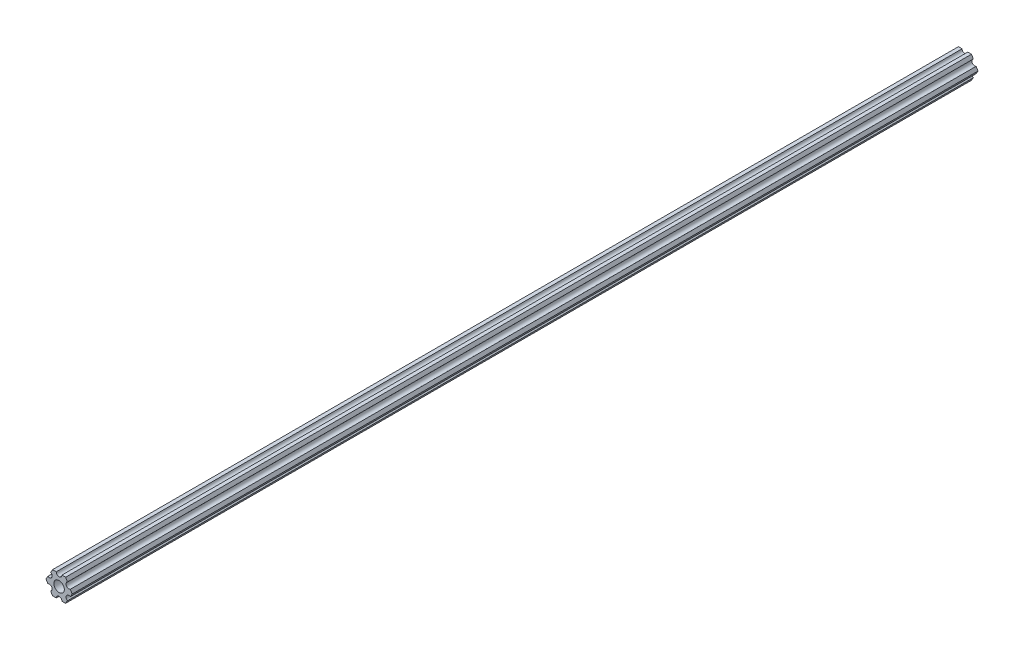
ISO-10303-21;
HEADER;
FILE_DESCRIPTION(('STEP AP214'),'2;1');
FILE_NAME('part.step','',(''),(''),'','','');
FILE_SCHEMA(('AUTOMOTIVE_DESIGN { 1 0 10303 214 1 1 1 1 }'));
ENDSEC;
DATA;
#1=APPLICATION_CONTEXT('core data for automotive mechanical design processes');
#2=APPLICATION_PROTOCOL_DEFINITION('international standard','automotive_design',2000,#1);
#3=PRODUCT_CONTEXT('',#1,'mechanical');
#4=PRODUCT('Part','Part','',(#3));
#5=PRODUCT_RELATED_PRODUCT_CATEGORY('part','',(#4));
#6=PRODUCT_DEFINITION_FORMATION('','',#4);
#7=PRODUCT_DEFINITION_CONTEXT('part definition',#1,'design');
#8=PRODUCT_DEFINITION('design','',#6,#7);
#9=PRODUCT_DEFINITION_SHAPE('','',#8);
#10=(LENGTH_UNIT() NAMED_UNIT(*) SI_UNIT(.MILLI.,.METRE.));
#11=(NAMED_UNIT(*) PLANE_ANGLE_UNIT() SI_UNIT($,.RADIAN.));
#12=(NAMED_UNIT(*) SI_UNIT($,.STERADIAN.) SOLID_ANGLE_UNIT());
#13=UNCERTAINTY_MEASURE_WITH_UNIT(LENGTH_MEASURE(1.E-05),#10,'distance_accuracy_value','');
#14=(GEOMETRIC_REPRESENTATION_CONTEXT(3) GLOBAL_UNCERTAINTY_ASSIGNED_CONTEXT((#13)) GLOBAL_UNIT_ASSIGNED_CONTEXT((#10,
#11,#12)) REPRESENTATION_CONTEXT('',''));
#15=CARTESIAN_POINT('',(0.,0.,0.));
#16=DIRECTION('',(0.,0.,1.));
#17=DIRECTION('',(1.,0.,0.));
#18=AXIS2_PLACEMENT_3D('',#15,#16,#17);
#19=CARTESIAN_POINT('',(6.29301142309098,-1.80018429024546,85.725));
#20=DIRECTION('',(-0.866025434075723,0.499999947533953,0.));
#21=DIRECTION('',(0.,0.,1.));
#22=AXIS2_PLACEMENT_3D('',#19,#20,#21);
#23=PLANE('',#22);
#24=DIRECTION('',(0.,0.,1.));
#25=VECTOR('',#24,1.);
#26=CARTESIAN_POINT('',(7.33234841870827,4.44212519169686E-07,85.725));
#27=LINE('',#26,#25);
#28=CARTESIAN_POINT('',(7.33234841870826,4.44212518961143E-07,-422.275));
#29=VERTEX_POINT('',#28);
#30=CARTESIAN_POINT('',(7.33234841870826,4.44212519315656E-07,85.725));
#31=VERTEX_POINT('',#30);
#32=EDGE_CURVE('E12',#29,#31,#27,.T.);
#33=ORIENTED_EDGE('',*,*,#32,.T.);
#34=DIRECTION('',(0.499999947533953,0.866025434075723,0.));
#35=VECTOR('',#34,1.);
#36=CARTESIAN_POINT('',(6.29301142309098,-1.80018429024546,85.725));
#37=LINE('',#36,#35);
#38=CARTESIAN_POINT('',(6.29301142309098,-1.80018429024546,85.725));
#39=VERTEX_POINT('',#38);
#40=EDGE_CURVE('E303',#39,#31,#37,.T.);
#41=ORIENTED_EDGE('',*,*,#40,.F.);
#42=DIRECTION('',(0.,0.,-1.));
#43=VECTOR('',#42,1.);
#44=CARTESIAN_POINT('',(6.29301142309098,-1.80018429024546,85.725));
#45=LINE('',#44,#43);
#46=CARTESIAN_POINT('',(6.29301142309098,-1.80018429024546,-422.275));
#47=VERTEX_POINT('',#46);
#48=EDGE_CURVE('E302',#39,#47,#45,.T.);
#49=ORIENTED_EDGE('',*,*,#48,.T.);
#50=DIRECTION('',(-0.499999947533953,-0.866025434075723,0.));
#51=VECTOR('',#50,1.);
#52=CARTESIAN_POINT('',(6.29301142309098,-1.80018429024546,-422.275));
#53=LINE('',#52,#51);
#54=EDGE_CURVE('E221',#29,#47,#53,.T.);
#55=ORIENTED_EDGE('',*,*,#54,.F.);
#56=EDGE_LOOP('',(#33,#41,#49,#55));
#57=FACE_BOUND('',#56,.T.);
#58=ADVANCED_FACE('F53',(#57),#23,.F.);
#59=CARTESIAN_POINT('',(7.33234841870827,4.44212519169686E-07,85.725));
#60=DIRECTION('',(-0.866025373493145,-0.500000052466057,0.));
#61=DIRECTION('',(-0.500000052466057,0.866025373493145,0.));
#62=AXIS2_PLACEMENT_3D('',#59,#60,#61);
#63=PLANE('',#62);
#64=DIRECTION('',(0.,0.,1.));
#65=VECTOR('',#64,1.);
#66=CARTESIAN_POINT('',(6.29301120497139,1.80018505273894,85.725));
#67=LINE('',#66,#65);
#68=CARTESIAN_POINT('',(6.29301120497139,1.80018505273894,-422.275));
#69=VERTEX_POINT('',#68);
#70=CARTESIAN_POINT('',(6.29301120497139,1.80018505273894,85.725));
#71=VERTEX_POINT('',#70);
#72=EDGE_CURVE('E61',#69,#71,#67,.T.);
#73=ORIENTED_EDGE('',*,*,#72,.T.);
#74=DIRECTION('',(-0.500000052466057,0.866025373493145,0.));
#75=VECTOR('',#74,1.);
#76=CARTESIAN_POINT('',(7.33234841870827,4.44212519198906E-07,85.725));
#77=LINE('',#76,#75);
#78=EDGE_CURVE('E307',#31,#71,#77,.T.);
#79=ORIENTED_EDGE('',*,*,#78,.F.);
#80=ORIENTED_EDGE('',*,*,#32,.F.);
#81=DIRECTION('',(0.500000052466055,-0.866025373493145,0.));
#82=VECTOR('',#81,1.);
#83=CARTESIAN_POINT('',(7.33234841870826,4.44212518961143E-07,-422.275));
#84=LINE('',#83,#82);
#85=EDGE_CURVE('E215',#69,#29,#84,.T.);
#86=ORIENTED_EDGE('',*,*,#85,.F.);
#87=EDGE_LOOP('',(#73,#79,#80,#86));
#88=FACE_BOUND('',#87,.T.);
#89=ADVANCED_FACE('F216',(#88),#63,.F.);
#90=CARTESIAN_POINT('',(4.70551103839172,4.54981561357972,85.725));
#91=DIRECTION('',(-0.866025373493151,-0.500000052466046,0.));
#92=DIRECTION('',(-0.500000052466046,0.866025373493151,0.));
#93=AXIS2_PLACEMENT_3D('',#90,#91,#92);
#94=PLANE('',#93);
#95=DIRECTION('',(0.,0.,1.));
#96=VECTOR('',#95,1.);
#97=CARTESIAN_POINT('',(3.66617382465481,6.35000022210627,85.725));
#98=LINE('',#97,#96);
#99=CARTESIAN_POINT('',(3.66617382465481,6.35000022210627,-422.275));
#100=VERTEX_POINT('',#99);
#101=CARTESIAN_POINT('',(3.66617382465481,6.35000022210627,85.725));
#102=VERTEX_POINT('',#101);
#103=EDGE_CURVE('E213',#100,#102,#98,.T.);
#104=ORIENTED_EDGE('',*,*,#103,.T.);
#105=DIRECTION('',(-0.500000052466046,0.866025373493151,0.));
#106=VECTOR('',#105,1.);
#107=CARTESIAN_POINT('',(4.70551103839172,4.54981561357972,85.725));
#108=LINE('',#107,#106);
#109=CARTESIAN_POINT('',(4.70551103839172,4.54981561357972,85.725));
#110=VERTEX_POINT('',#109);
#111=EDGE_CURVE('E338',#110,#102,#108,.T.);
#112=ORIENTED_EDGE('',*,*,#111,.F.);
#113=DIRECTION('',(0.,0.,1.));
#114=VECTOR('',#113,1.);
#115=CARTESIAN_POINT('',(4.70551103839172,4.54981561357972,85.725));
#116=LINE('',#115,#114);
#117=CARTESIAN_POINT('',(4.70551103839172,4.54981561357972,-422.275));
#118=VERTEX_POINT('',#117);
#119=EDGE_CURVE('E301',#118,#110,#116,.T.);
#120=ORIENTED_EDGE('',*,*,#119,.F.);
#121=DIRECTION('',(0.500000052466045,-0.866025373493151,0.));
#122=VECTOR('',#121,1.);
#123=CARTESIAN_POINT('',(4.70551103839172,4.54981561357972,-422.275));
#124=LINE('',#123,#122);
#125=EDGE_CURVE('E227',#100,#118,#124,.T.);
#126=ORIENTED_EDGE('',*,*,#125,.F.);
#127=EDGE_LOOP('',(#104,#112,#120,#126));
#128=FACE_BOUND('',#127,.T.);
#129=ADVANCED_FACE('F414',(#128),#94,.F.);
#130=CARTESIAN_POINT('',(3.66617382465481,6.35000022210627,85.725));
#131=DIRECTION('',(6.05825850611185E-08,-1.,0.));
#132=DIRECTION('',(0.,0.,-1.));
#133=AXIS2_PLACEMENT_3D('',#130,#131,#132);
#134=PLANE('',#133);
#135=DIRECTION('',(0.,0.,1.));
#136=VECTOR('',#135,1.);
#137=CARTESIAN_POINT('',(1.58749961530074,6.35000009617482,85.725));
#138=LINE('',#137,#136);
#139=CARTESIAN_POINT('',(1.58749961530073,6.35000015914054,-422.275));
#140=VERTEX_POINT('',#139);
#141=CARTESIAN_POINT('',(1.58749961530073,6.35000015914054,85.725));
#142=VERTEX_POINT('',#141);
#143=EDGE_CURVE('E335',#140,#142,#138,.T.);
#144=ORIENTED_EDGE('',*,*,#143,.T.);
#145=DIRECTION('',(-1.,0.,0.));
#146=VECTOR('',#145,1.);
#147=CARTESIAN_POINT('',(5.49926112168156,6.35000022210627,85.725));
#148=LINE('',#147,#146);
#149=EDGE_CURVE('E342',#102,#142,#148,.T.);
#150=ORIENTED_EDGE('',*,*,#149,.F.);
#151=ORIENTED_EDGE('',*,*,#103,.F.);
#152=DIRECTION('',(1.,3.02912931564594E-08,0.));
#153=VECTOR('',#152,1.);
#154=CARTESIAN_POINT('',(3.66617382465481,6.35000022210627,-422.275));
#155=LINE('',#154,#153);
#156=EDGE_CURVE('E289',#140,#100,#155,.T.);
#157=ORIENTED_EDGE('',*,*,#156,.F.);
#158=EDGE_LOOP('',(#144,#150,#151,#157));
#159=FACE_BOUND('',#158,.T.);
#160=ADVANCED_FACE('F417',(#159),#134,.F.);
#161=CARTESIAN_POINT('',(-3.84699260060323E-07,6.35,85.725));
#162=DIRECTION('',(0.,0.,-1.));
#163=DIRECTION('',(-1.,0.,0.));
#164=AXIS2_PLACEMENT_3D('',#161,#162,#163);
#165=CYLINDRICAL_SURFACE('',#164,1.5875);
#166=DIRECTION('',(0.,0.,1.));
#167=VECTOR('',#166,1.);
#168=CARTESIAN_POINT('',(-1.58750038469926,6.34999990382518,85.725));
#169=LINE('',#168,#167);
#170=CARTESIAN_POINT('',(-1.58750038469926,6.34999990382519,-422.275));
#171=VERTEX_POINT('',#170);
#172=CARTESIAN_POINT('',(-1.58750038469926,6.34999990382519,85.725));
#173=VERTEX_POINT('',#172);
#174=EDGE_CURVE('E332',#171,#173,#169,.T.);
#175=ORIENTED_EDGE('',*,*,#174,.T.);
#176=CARTESIAN_POINT('',(-3.84699260060323E-07,6.35,85.725));
#177=DIRECTION('',(0.,0.,-1.));
#178=DIRECTION('',(-1.,0.,0.));
#179=AXIS2_PLACEMENT_3D('',#176,#177,#178);
#180=CIRCLE('',#179,1.5875);
#181=EDGE_CURVE('E346',#142,#173,#180,.T.);
#182=ORIENTED_EDGE('',*,*,#181,.F.);
#183=ORIENTED_EDGE('',*,*,#143,.F.);
#184=CARTESIAN_POINT('',(-3.84699260060323E-07,6.35,-422.275));
#185=DIRECTION('',(0.,0.,1.));
#186=DIRECTION('',(-1.,0.,0.));
#187=AXIS2_PLACEMENT_3D('',#184,#185,#186);
#188=CIRCLE('',#187,1.5875);
#189=EDGE_CURVE('E285',#171,#140,#188,.T.);
#190=ORIENTED_EDGE('',*,*,#189,.F.);
#191=EDGE_LOOP('',(#175,#182,#183,#190));
#192=FACE_BOUND('',#191,.T.);
#193=ADVANCED_FACE('F466',(#192),#165,.F.);
#194=CARTESIAN_POINT('',(-1.58750038469926,6.34999990382518,85.725));
#195=DIRECTION('',(6.05825963273174E-08,-1.,0.));
#196=DIRECTION('',(0.,0.,-1.));
#197=AXIS2_PLACEMENT_3D('',#194,#195,#196);
#198=PLANE('',#197);
#199=DIRECTION('',(0.,0.,1.));
#200=VECTOR('',#199,1.);
#201=CARTESIAN_POINT('',(-3.66617459405349,6.3499997778937,85.725));
#202=LINE('',#201,#200);
#203=CARTESIAN_POINT('',(-3.66617454558244,6.34999986184803,-422.275));
#204=VERTEX_POINT('',#203);
#205=CARTESIAN_POINT('',(-3.66617454558244,6.34999986184803,85.725));
#206=VERTEX_POINT('',#205);
#207=EDGE_CURVE('E325',#204,#206,#202,.T.);
#208=ORIENTED_EDGE('',*,*,#207,.T.);
#209=DIRECTION('',(-1.,0.,0.));
#210=VECTOR('',#209,1.);
#211=CARTESIAN_POINT('',(5.49926112168156,6.34999990382519,85.725));
#212=LINE('',#211,#210);
#213=EDGE_CURVE('E350',#173,#206,#212,.T.);
#214=ORIENTED_EDGE('',*,*,#213,.F.);
#215=ORIENTED_EDGE('',*,*,#174,.F.);
#216=DIRECTION('',(1.,2.0194198968488E-08,0.));
#217=VECTOR('',#216,1.);
#218=CARTESIAN_POINT('',(-1.58750038469926,6.34999990382519,-422.275));
#219=LINE('',#218,#217);
#220=EDGE_CURVE('E281',#204,#171,#219,.T.);
#221=ORIENTED_EDGE('',*,*,#220,.F.);
#222=EDGE_LOOP('',(#208,#214,#215,#221));
#223=FACE_BOUND('',#222,.T.);
#224=ADVANCED_FACE('F463',(#223),#198,.F.);
#225=CARTESIAN_POINT('',(-3.66617459405349,6.3499997778937,85.725));
#226=DIRECTION('',(0.866025434075729,-0.499999947533942,0.));
#227=DIRECTION('',(0.,0.,-1.));
#228=AXIS2_PLACEMENT_3D('',#225,#226,#227);
#229=PLANE('',#228);
#230=DIRECTION('',(0.,0.,1.));
#231=VECTOR('',#230,1.);
#232=CARTESIAN_POINT('',(-4.70551158967065,4.54981504343587,85.725));
#233=LINE('',#232,#231);
#234=CARTESIAN_POINT('',(-4.70551158967065,4.54981504343587,-422.275));
#235=VERTEX_POINT('',#234);
#236=CARTESIAN_POINT('',(-4.70551158967065,4.54981504343587,85.725));
#237=VERTEX_POINT('',#236);
#238=EDGE_CURVE('E322',#235,#237,#233,.T.);
#239=ORIENTED_EDGE('',*,*,#238,.T.);
#240=DIRECTION('',(-0.499999947533943,-0.866025434075729,0.));
#241=VECTOR('',#240,1.);
#242=CARTESIAN_POINT('',(-3.66617459405349,6.3499997778937,85.725));
#243=LINE('',#242,#241);
#244=EDGE_CURVE('E354',#206,#237,#243,.T.);
#245=ORIENTED_EDGE('',*,*,#244,.F.);
#246=ORIENTED_EDGE('',*,*,#207,.F.);
#247=DIRECTION('',(0.499999947533939,0.866025434075731,0.));
#248=VECTOR('',#247,1.);
#249=CARTESIAN_POINT('',(-3.66617454558244,6.34999986184803,-422.275));
#250=LINE('',#249,#248);
#251=EDGE_CURVE('E277',#235,#204,#250,.T.);
#252=ORIENTED_EDGE('',*,*,#251,.F.);
#253=EDGE_LOOP('',(#239,#245,#246,#252));
#254=FACE_BOUND('',#253,.T.);
#255=ADVANCED_FACE('F459',(#254),#229,.F.);
#256=CARTESIAN_POINT('',(-5.49926150638082,3.17499966684067,85.725));
#257=DIRECTION('',(0.,0.,-1.));
#258=DIRECTION('',(-1.,0.,0.));
#259=AXIS2_PLACEMENT_3D('',#256,#257,#258);
#260=CYLINDRICAL_SURFACE('',#259,1.5875);
#261=DIRECTION('',(0.,0.,1.));
#262=VECTOR('',#261,1.);
#263=CARTESIAN_POINT('',(-6.29301142309098,1.80018429024547,85.725));
#264=LINE('',#263,#262);
#265=CARTESIAN_POINT('',(-6.29301142309098,1.80018429024546,-422.275));
#266=VERTEX_POINT('',#265);
#267=CARTESIAN_POINT('',(-6.29301142309098,1.80018429024547,85.725));
#268=VERTEX_POINT('',#267);
#269=EDGE_CURVE('E326',#266,#268,#264,.T.);
#270=ORIENTED_EDGE('',*,*,#269,.T.);
#271=CARTESIAN_POINT('',(-5.49926150638082,3.17499966684067,85.725));
#272=DIRECTION('',(0.,0.,-1.));
#273=DIRECTION('',(-1.,0.,0.));
#274=AXIS2_PLACEMENT_3D('',#271,#272,#273);
#275=CIRCLE('',#274,1.5875);
#276=EDGE_CURVE('E364',#237,#268,#275,.T.);
#277=ORIENTED_EDGE('',*,*,#276,.F.);
#278=ORIENTED_EDGE('',*,*,#238,.F.);
#279=CARTESIAN_POINT('',(-5.49926150638082,3.17499966684067,-422.275));
#280=DIRECTION('',(0.,0.,1.));
#281=DIRECTION('',(-1.,0.,0.));
#282=AXIS2_PLACEMENT_3D('',#279,#280,#281);
#283=CIRCLE('',#282,1.5875);
#284=EDGE_CURVE('E273',#266,#235,#283,.T.);
#285=ORIENTED_EDGE('',*,*,#284,.F.);
#286=EDGE_LOOP('',(#270,#277,#278,#285));
#287=FACE_BOUND('',#286,.T.);
#288=ADVANCED_FACE('F455',(#287),#260,.F.);
#289=CARTESIAN_POINT('',(-6.29301142309098,1.80018429024547,85.725));
#290=DIRECTION('',(0.866025434075724,-0.499999947533952,0.));
#291=DIRECTION('',(0.,0.,-1.));
#292=AXIS2_PLACEMENT_3D('',#289,#290,#291);
#293=PLANE('',#292);
#294=DIRECTION('',(0.,0.,1.));
#295=VECTOR('',#294,1.);
#296=CARTESIAN_POINT('',(-7.33234841870827,-4.44212523790841E-07,85.725));
#297=LINE('',#296,#295);
#298=CARTESIAN_POINT('',(-7.33234841870826,-4.44212524036367E-07,-422.275));
#299=VERTEX_POINT('',#298);
#300=CARTESIAN_POINT('',(-7.33234841870826,-4.44212524036367E-07,85.725));
#301=VERTEX_POINT('',#300);
#302=EDGE_CURVE('E319',#299,#301,#297,.T.);
#303=ORIENTED_EDGE('',*,*,#302,.T.);
#304=DIRECTION('',(-0.499999947533952,-0.866025434075724,0.));
#305=VECTOR('',#304,1.);
#306=CARTESIAN_POINT('',(-6.29301142309098,1.80018429024547,85.725));
#307=LINE('',#306,#305);
#308=EDGE_CURVE('E360',#268,#301,#307,.T.);
#309=ORIENTED_EDGE('',*,*,#308,.F.);
#310=ORIENTED_EDGE('',*,*,#269,.F.);
#311=DIRECTION('',(0.499999947533951,0.866025434075724,0.));
#312=VECTOR('',#311,1.);
#313=CARTESIAN_POINT('',(-6.29301142309098,1.80018429024547,-422.275));
#314=LINE('',#313,#312);
#315=EDGE_CURVE('E269',#299,#266,#314,.T.);
#316=ORIENTED_EDGE('',*,*,#315,.F.);
#317=EDGE_LOOP('',(#303,#309,#310,#316));
#318=FACE_BOUND('',#317,.T.);
#319=ADVANCED_FACE('F451',(#318),#293,.F.);
#320=CARTESIAN_POINT('',(-7.33234841870827,-4.44212523790841E-07,85.725));
#321=DIRECTION('',(0.866025373493151,0.500000052466045,0.));
#322=DIRECTION('',(0.,0.,-1.));
#323=AXIS2_PLACEMENT_3D('',#320,#321,#322);
#324=PLANE('',#323);
#325=DIRECTION('',(0.,0.,1.));
#326=VECTOR('',#325,1.);
#327=CARTESIAN_POINT('',(-6.29301120497141,-1.80018505273897,85.725));
#328=LINE('',#327,#326);
#329=CARTESIAN_POINT('',(-6.29301120497141,-1.80018505273897,-422.275));
#330=VERTEX_POINT('',#329);
#331=CARTESIAN_POINT('',(-6.29301120497141,-1.80018505273897,85.725));
#332=VERTEX_POINT('',#331);
#333=EDGE_CURVE('E312',#330,#332,#328,.T.);
#334=ORIENTED_EDGE('',*,*,#333,.T.);
#335=DIRECTION('',(0.500000052466045,-0.866025373493151,0.));
#336=VECTOR('',#335,1.);
#337=CARTESIAN_POINT('',(-7.33234841870827,-4.44212523969395E-07,85.725));
#338=LINE('',#337,#336);
#339=EDGE_CURVE('E355',#301,#332,#338,.T.);
#340=ORIENTED_EDGE('',*,*,#339,.F.);
#341=ORIENTED_EDGE('',*,*,#302,.F.);
#342=DIRECTION('',(-0.500000052466045,0.866025373493152,0.));
#343=VECTOR('',#342,1.);
#344=CARTESIAN_POINT('',(-7.33234841870826,-4.44212524036367E-07,-422.275));
#345=LINE('',#344,#343);
#346=EDGE_CURVE('E265',#330,#299,#345,.T.);
#347=ORIENTED_EDGE('',*,*,#346,.F.);
#348=EDGE_LOOP('',(#334,#340,#341,#347));
#349=FACE_BOUND('',#348,.T.);
#350=ADVANCED_FACE('F447',(#349),#324,.F.);
#351=CARTESIAN_POINT('',(-5.49926112168156,-3.17500033315934,85.725));
#352=DIRECTION('',(0.,0.,-1.));
#353=DIRECTION('',(-1.,0.,0.));
#354=AXIS2_PLACEMENT_3D('',#351,#352,#353);
#355=CYLINDRICAL_SURFACE('',#354,1.5875);
#356=DIRECTION('',(0.,0.,1.));
#357=VECTOR('',#356,1.);
#358=CARTESIAN_POINT('',(-4.70551103839172,-4.54981561357972,85.725));
#359=LINE('',#358,#357);
#360=CARTESIAN_POINT('',(-4.70551103839172,-4.54981561357972,-422.275));
#361=VERTEX_POINT('',#360);
#362=CARTESIAN_POINT('',(-4.70551103839172,-4.54981561357972,85.725));
#363=VERTEX_POINT('',#362);
#364=EDGE_CURVE('E309',#361,#363,#359,.T.);
#365=ORIENTED_EDGE('',*,*,#364,.T.);
#366=CARTESIAN_POINT('',(-5.49926112168156,-3.17500033315934,85.725));
#367=DIRECTION('',(0.,0.,-1.));
#368=DIRECTION('',(-1.,0.,0.));
#369=AXIS2_PLACEMENT_3D('',#366,#367,#368);
#370=CIRCLE('',#369,1.5875);
#371=EDGE_CURVE('E359',#332,#363,#370,.T.);
#372=ORIENTED_EDGE('',*,*,#371,.F.);
#373=ORIENTED_EDGE('',*,*,#333,.F.);
#374=CARTESIAN_POINT('',(-5.49926112168156,-3.17500033315934,-422.275));
#375=DIRECTION('',(0.,0.,1.));
#376=DIRECTION('',(-1.,0.,0.));
#377=AXIS2_PLACEMENT_3D('',#374,#375,#376);
#378=CIRCLE('',#377,1.5875);
#379=EDGE_CURVE('E261',#361,#330,#378,.T.);
#380=ORIENTED_EDGE('',*,*,#379,.F.);
#381=EDGE_LOOP('',(#365,#372,#373,#380));
#382=FACE_BOUND('',#381,.T.);
#383=ADVANCED_FACE('F443',(#382),#355,.F.);
#384=CARTESIAN_POINT('',(-4.70551103839172,-4.54981561357972,85.725));
#385=DIRECTION('',(0.866025373493152,0.500000052466045,0.));
#386=DIRECTION('',(0.,0.,-1.));
#387=AXIS2_PLACEMENT_3D('',#384,#385,#386);
#388=PLANE('',#387);
#389=DIRECTION('',(0.,0.,1.));
#390=VECTOR('',#389,1.);
#391=CARTESIAN_POINT('',(-3.66617382465481,-6.35000022210628,85.725));
#392=LINE('',#391,#390);
#393=CARTESIAN_POINT('',(-3.66617382465481,-6.35000022210628,-422.275));
#394=VERTEX_POINT('',#393);
#395=CARTESIAN_POINT('',(-3.66617382465481,-6.35000022210628,85.725));
#396=VERTEX_POINT('',#395);
#397=EDGE_CURVE('E313',#394,#396,#392,.T.);
#398=ORIENTED_EDGE('',*,*,#397,.T.);
#399=DIRECTION('',(0.500000052466045,-0.866025373493151,0.));
#400=VECTOR('',#399,1.);
#401=CARTESIAN_POINT('',(-4.70551103839172,-4.54981561357972,85.725));
#402=LINE('',#401,#400);
#403=EDGE_CURVE('E374',#363,#396,#402,.T.);
#404=ORIENTED_EDGE('',*,*,#403,.F.);
#405=ORIENTED_EDGE('',*,*,#364,.F.);
#406=DIRECTION('',(-0.500000052466043,0.866025373493152,0.));
#407=VECTOR('',#406,1.);
#408=CARTESIAN_POINT('',(-4.70551103839172,-4.54981561357972,-422.275));
#409=LINE('',#408,#407);
#410=EDGE_CURVE('E257',#394,#361,#409,.T.);
#411=ORIENTED_EDGE('',*,*,#410,.F.);
#412=EDGE_LOOP('',(#398,#404,#405,#411));
#413=FACE_BOUND('',#412,.T.);
#414=ADVANCED_FACE('F439',(#413),#388,.F.);
#415=CARTESIAN_POINT('',(-3.66617382465481,-6.35000022210628,85.725));
#416=DIRECTION('',(-6.05825854783851E-08,1.,0.));
#417=DIRECTION('',(0.,0.,1.));
#418=AXIS2_PLACEMENT_3D('',#415,#416,#417);
#419=PLANE('',#418);
#420=DIRECTION('',(0.,0.,1.));
#421=VECTOR('',#420,1.);
#422=CARTESIAN_POINT('',(-1.58749961530074,-6.35,85.725));
#423=LINE('',#422,#421);
#424=CARTESIAN_POINT('',(-1.58749961530073,-6.35000011105314,-422.275));
#425=VERTEX_POINT('',#424);
#426=CARTESIAN_POINT('',(-1.58749961530073,-6.35000011105314,85.725));
#427=VERTEX_POINT('',#426);
#428=EDGE_CURVE('E84',#425,#427,#423,.T.);
#429=ORIENTED_EDGE('',*,*,#428,.T.);
#430=DIRECTION('',(1.,0.,0.));
#431=VECTOR('',#430,1.);
#432=CARTESIAN_POINT('',(5.49926112168156,-6.35000022210628,85.725));
#433=LINE('',#432,#431);
#434=EDGE_CURVE('E378',#396,#427,#433,.T.);
#435=ORIENTED_EDGE('',*,*,#434,.F.);
#436=ORIENTED_EDGE('',*,*,#397,.F.);
#437=DIRECTION('',(-0.999999999999999,-5.34249856349036E-08,0.));
#438=VECTOR('',#437,1.);
#439=CARTESIAN_POINT('',(-3.66617382465481,-6.35000022210628,-422.275));
#440=LINE('',#439,#438);
#441=EDGE_CURVE('E253',#425,#394,#440,.T.);
#442=ORIENTED_EDGE('',*,*,#441,.F.);
#443=EDGE_LOOP('',(#429,#435,#436,#442));
#444=FACE_BOUND('',#443,.T.);
#445=ADVANCED_FACE('F436',(#444),#419,.F.);
#446=CARTESIAN_POINT('',(3.8469926204343E-07,-6.35,85.725));
#447=DIRECTION('',(0.,0.,-1.));
#448=DIRECTION('',(-1.,0.,0.));
#449=AXIS2_PLACEMENT_3D('',#446,#447,#448);
#450=CYLINDRICAL_SURFACE('',#449,1.5875);
#451=DIRECTION('',(0.,0.,1.));
#452=VECTOR('',#451,1.);
#453=CARTESIAN_POINT('',(1.58750038469926,-6.34999990382518,85.725));
#454=LINE('',#453,#452);
#455=CARTESIAN_POINT('',(1.58750038469926,-6.34999990382519,-422.275));
#456=VERTEX_POINT('',#455);
#457=CARTESIAN_POINT('',(1.58750038469926,-6.34999990382519,85.725));
#458=VERTEX_POINT('',#457);
#459=EDGE_CURVE('E73',#456,#458,#454,.T.);
#460=ORIENTED_EDGE('',*,*,#459,.T.);
#461=CARTESIAN_POINT('',(3.8469926204343E-07,-6.35,85.725));
#462=DIRECTION('',(0.,0.,-1.));
#463=DIRECTION('',(-1.,0.,0.));
#464=AXIS2_PLACEMENT_3D('',#461,#462,#463);
#465=CIRCLE('',#464,1.5875);
#466=EDGE_CURVE('E382',#427,#458,#465,.T.);
#467=ORIENTED_EDGE('',*,*,#466,.F.);
#468=ORIENTED_EDGE('',*,*,#428,.F.);
#469=CARTESIAN_POINT('',(3.8469926204343E-07,-6.35,-422.275));
#470=DIRECTION('',(0.,0.,1.));
#471=DIRECTION('',(-1.,0.,0.));
#472=AXIS2_PLACEMENT_3D('',#469,#470,#471);
#473=CIRCLE('',#472,1.5875);
#474=EDGE_CURVE('E249',#456,#425,#473,.T.);
#475=ORIENTED_EDGE('',*,*,#474,.F.);
#476=EDGE_LOOP('',(#460,#467,#468,#475));
#477=FACE_BOUND('',#476,.T.);
#478=ADVANCED_FACE('F434',(#477),#450,.F.);
#479=CARTESIAN_POINT('',(1.58750038469926,-6.34999990382518,85.725));
#480=DIRECTION('',(-6.05825721258438E-08,1.,0.));
#481=DIRECTION('',(0.,0.,1.));
#482=AXIS2_PLACEMENT_3D('',#479,#480,#481);
#483=PLANE('',#482);
#484=DIRECTION('',(0.,0.,1.));
#485=VECTOR('',#484,1.);
#486=CARTESIAN_POINT('',(3.66617459405346,-6.34999977789375,85.725));
#487=LINE('',#486,#485);
#488=CARTESIAN_POINT('',(3.66617454558244,-6.34999986184804,-422.275));
#489=VERTEX_POINT('',#488);
#490=CARTESIAN_POINT('',(3.66617454558244,-6.34999986184804,85.725));
#491=VERTEX_POINT('',#490);
#492=EDGE_CURVE('E383',#489,#491,#487,.T.);
#493=ORIENTED_EDGE('',*,*,#492,.T.);
#494=DIRECTION('',(1.,0.,0.));
#495=VECTOR('',#494,1.);
#496=CARTESIAN_POINT('',(5.49926112168156,-6.34999990382519,85.725));
#497=LINE('',#496,#495);
#498=EDGE_CURVE('E390',#458,#491,#497,.T.);
#499=ORIENTED_EDGE('',*,*,#498,.F.);
#500=ORIENTED_EDGE('',*,*,#459,.F.);
#501=DIRECTION('',(-1.,-2.01941943785532E-08,0.));
#502=VECTOR('',#501,1.);
#503=CARTESIAN_POINT('',(1.58750038469926,-6.34999990382519,-422.275));
#504=LINE('',#503,#502);
#505=EDGE_CURVE('E245',#489,#456,#504,.T.);
#506=ORIENTED_EDGE('',*,*,#505,.F.);
#507=EDGE_LOOP('',(#493,#499,#500,#506));
#508=FACE_BOUND('',#507,.T.);
#509=ADVANCED_FACE('F433',(#508),#483,.F.);
#510=CARTESIAN_POINT('',(3.66617459405346,-6.34999977789375,85.725));
#511=DIRECTION('',(-0.86602543407573,0.499999947533941,0.));
#512=DIRECTION('',(0.,0.,1.));
#513=AXIS2_PLACEMENT_3D('',#510,#511,#512);
#514=PLANE('',#513);
#515=DIRECTION('',(0.,0.,-1.));
#516=VECTOR('',#515,1.);
#517=CARTESIAN_POINT('',(4.70551158967065,-4.54981504343587,85.725));
#518=LINE('',#517,#516);
#519=CARTESIAN_POINT('',(4.70551158967065,-4.54981504343587,85.725));
#520=VERTEX_POINT('',#519);
#521=CARTESIAN_POINT('',(4.70551158967065,-4.54981504343587,-422.275));
#522=VERTEX_POINT('',#521);
#523=EDGE_CURVE('E386',#520,#522,#518,.T.);
#524=ORIENTED_EDGE('',*,*,#523,.F.);
#525=DIRECTION('',(0.49999994753394,0.86602543407573,0.));
#526=VECTOR('',#525,1.);
#527=CARTESIAN_POINT('',(3.66617459405346,-6.34999977789376,85.725));
#528=LINE('',#527,#526);
#529=EDGE_CURVE('E308',#491,#520,#528,.T.);
#530=ORIENTED_EDGE('',*,*,#529,.F.);
#531=ORIENTED_EDGE('',*,*,#492,.F.);
#532=DIRECTION('',(-0.499999947533941,-0.86602543407573,0.));
#533=VECTOR('',#532,1.);
#534=CARTESIAN_POINT('',(3.66617454558244,-6.34999986184804,-422.275));
#535=LINE('',#534,#533);
#536=EDGE_CURVE('E241',#522,#489,#535,.T.);
#537=ORIENTED_EDGE('',*,*,#536,.F.);
#538=EDGE_LOOP('',(#524,#530,#531,#537));
#539=FACE_BOUND('',#538,.T.);
#540=ADVANCED_FACE('F430',(#539),#514,.F.);
#541=CARTESIAN_POINT('',(5.49926112168156,3.17500033315934,85.725));
#542=DIRECTION('',(0.,0.,1.));
#543=DIRECTION('',(1.,0.,0.));
#544=AXIS2_PLACEMENT_3D('',#541,#542,#543);
#545=PLANE('',#544);
#546=CARTESIAN_POINT('',(0.,0.,85.725));
#547=DIRECTION('',(0.,0.,-1.));
#548=DIRECTION('',(-1.,0.,0.));
#549=AXIS2_PLACEMENT_3D('',#546,#547,#548);
#550=CIRCLE('',#549,2.9337);
#551=CARTESIAN_POINT('',(-2.9337,0.,85.725));
#552=VERTEX_POINT('',#551);
#553=EDGE_CURVE('E294',#552,#552,#550,.T.);
#554=ORIENTED_EDGE('',*,*,#553,.T.);
#555=EDGE_LOOP('',(#554));
#556=FACE_BOUND('',#555,.T.);
#557=ORIENTED_EDGE('',*,*,#529,.T.);
#558=CARTESIAN_POINT('',(5.49926150638082,-3.17499966684067,85.725));
#559=DIRECTION('',(0.,0.,-1.));
#560=DIRECTION('',(-1.,0.,0.));
#561=AXIS2_PLACEMENT_3D('',#558,#559,#560);
#562=CIRCLE('',#561,1.5875);
#563=EDGE_CURVE('E298',#520,#39,#562,.T.);
#564=ORIENTED_EDGE('',*,*,#563,.T.);
#565=ORIENTED_EDGE('',*,*,#40,.T.);
#566=ORIENTED_EDGE('',*,*,#78,.T.);
#567=CARTESIAN_POINT('',(5.49926112168156,3.17500033315934,85.725));
#568=DIRECTION('',(0.,0.,-1.));
#569=DIRECTION('',(-1.,0.,0.));
#570=AXIS2_PLACEMENT_3D('',#567,#568,#569);
#571=CIRCLE('',#570,1.5875);
#572=EDGE_CURVE('E208',#71,#110,#571,.T.);
#573=ORIENTED_EDGE('',*,*,#572,.T.);
#574=ORIENTED_EDGE('',*,*,#111,.T.);
#575=ORIENTED_EDGE('',*,*,#149,.T.);
#576=ORIENTED_EDGE('',*,*,#181,.T.);
#577=ORIENTED_EDGE('',*,*,#213,.T.);
#578=ORIENTED_EDGE('',*,*,#244,.T.);
#579=ORIENTED_EDGE('',*,*,#276,.T.);
#580=ORIENTED_EDGE('',*,*,#308,.T.);
#581=ORIENTED_EDGE('',*,*,#339,.T.);
#582=ORIENTED_EDGE('',*,*,#371,.T.);
#583=ORIENTED_EDGE('',*,*,#403,.T.);
#584=ORIENTED_EDGE('',*,*,#434,.T.);
#585=ORIENTED_EDGE('',*,*,#466,.T.);
#586=ORIENTED_EDGE('',*,*,#498,.T.);
#587=EDGE_LOOP('',(#557,#564,#565,#566,#573,#574,#575,#576,#577,#578,#579,#580,#581,#582,#583,
#584,#585,#586));
#588=FACE_BOUND('',#587,.T.);
#589=ADVANCED_FACE('F420',(#556,#588),#545,.T.);
#590=CARTESIAN_POINT('',(5.49926112168156,3.17500033315934,85.725));
#591=DIRECTION('',(0.,0.,-1.));
#592=DIRECTION('',(-1.,0.,0.));
#593=AXIS2_PLACEMENT_3D('',#590,#591,#592);
#594=CYLINDRICAL_SURFACE('',#593,1.5875);
#595=ORIENTED_EDGE('',*,*,#572,.F.);
#596=ORIENTED_EDGE('',*,*,#72,.F.);
#597=CARTESIAN_POINT('',(5.49926112168156,3.17500033315934,-422.275));
#598=DIRECTION('',(0.,0.,1.));
#599=DIRECTION('',(-1.,0.,0.));
#600=AXIS2_PLACEMENT_3D('',#597,#598,#599);
#601=CIRCLE('',#600,1.5875);
#602=EDGE_CURVE('E205',#118,#69,#601,.T.);
#603=ORIENTED_EDGE('',*,*,#602,.F.);
#604=ORIENTED_EDGE('',*,*,#119,.T.);
#605=EDGE_LOOP('',(#595,#596,#603,#604));
#606=FACE_BOUND('',#605,.T.);
#607=ADVANCED_FACE('F202',(#606),#594,.F.);
#608=CARTESIAN_POINT('',(5.49926150638082,-3.17499966684067,85.725));
#609=DIRECTION('',(0.,0.,-1.));
#610=DIRECTION('',(-1.,0.,0.));
#611=AXIS2_PLACEMENT_3D('',#608,#609,#610);
#612=CYLINDRICAL_SURFACE('',#611,1.5875);
#613=ORIENTED_EDGE('',*,*,#563,.F.);
#614=ORIENTED_EDGE('',*,*,#523,.T.);
#615=CARTESIAN_POINT('',(5.49926150638082,-3.17499966684067,-422.275));
#616=DIRECTION('',(0.,0.,1.));
#617=DIRECTION('',(-1.,0.,0.));
#618=AXIS2_PLACEMENT_3D('',#615,#616,#617);
#619=CIRCLE('',#618,1.5875);
#620=EDGE_CURVE('E237',#47,#522,#619,.T.);
#621=ORIENTED_EDGE('',*,*,#620,.F.);
#622=ORIENTED_EDGE('',*,*,#48,.F.);
#623=EDGE_LOOP('',(#613,#614,#621,#622));
#624=FACE_BOUND('',#623,.T.);
#625=ADVANCED_FACE('F425',(#624),#612,.F.);
#626=CARTESIAN_POINT('',(0.,0.,85.725));
#627=DIRECTION('',(0.,0.,-1.));
#628=DIRECTION('',(-1.,0.,0.));
#629=AXIS2_PLACEMENT_3D('',#626,#627,#628);
#630=CYLINDRICAL_SURFACE('',#629,2.9337);
#631=ORIENTED_EDGE('',*,*,#553,.F.);
#632=EDGE_LOOP('',(#631));
#633=FACE_BOUND('',#632,.T.);
#634=CARTESIAN_POINT('',(0.,0.,-422.275));
#635=DIRECTION('',(0.,0.,-1.));
#636=DIRECTION('',(-1.,0.,0.));
#637=AXIS2_PLACEMENT_3D('',#634,#635,#636);
#638=CIRCLE('',#637,2.9337);
#639=CARTESIAN_POINT('',(-2.9337,0.,-422.275));
#640=VERTEX_POINT('',#639);
#641=EDGE_CURVE('E229',#640,#640,#638,.T.);
#642=ORIENTED_EDGE('',*,*,#641,.T.);
#643=EDGE_LOOP('',(#642));
#644=FACE_BOUND('',#643,.T.);
#645=ADVANCED_FACE('F485',(#633,#644),#630,.F.);
#646=CARTESIAN_POINT('',(5.49926112168156,3.17500033315934,-422.275));
#647=DIRECTION('',(0.,0.,-1.));
#648=DIRECTION('',(-1.,0.,0.));
#649=AXIS2_PLACEMENT_3D('',#646,#647,#648);
#650=PLANE('',#649);
#651=ORIENTED_EDGE('',*,*,#602,.T.);
#652=ORIENTED_EDGE('',*,*,#85,.T.);
#653=ORIENTED_EDGE('',*,*,#54,.T.);
#654=ORIENTED_EDGE('',*,*,#620,.T.);
#655=ORIENTED_EDGE('',*,*,#536,.T.);
#656=ORIENTED_EDGE('',*,*,#505,.T.);
#657=ORIENTED_EDGE('',*,*,#474,.T.);
#658=ORIENTED_EDGE('',*,*,#441,.T.);
#659=ORIENTED_EDGE('',*,*,#410,.T.);
#660=ORIENTED_EDGE('',*,*,#379,.T.);
#661=ORIENTED_EDGE('',*,*,#346,.T.);
#662=ORIENTED_EDGE('',*,*,#315,.T.);
#663=ORIENTED_EDGE('',*,*,#284,.T.);
#664=ORIENTED_EDGE('',*,*,#251,.T.);
#665=ORIENTED_EDGE('',*,*,#220,.T.);
#666=ORIENTED_EDGE('',*,*,#189,.T.);
#667=ORIENTED_EDGE('',*,*,#156,.T.);
#668=ORIENTED_EDGE('',*,*,#125,.T.);
#669=EDGE_LOOP('',(#651,#652,#653,#654,#655,#656,#657,#658,#659,#660,#661,#662,#663,#664,#665,
#666,#667,#668));
#670=FACE_BOUND('',#669,.T.);
#671=ORIENTED_EDGE('',*,*,#641,.F.);
#672=EDGE_LOOP('',(#671));
#673=FACE_BOUND('',#672,.T.);
#674=ADVANCED_FACE('F223',(#670,#673),#650,.T.);
#675=CLOSED_SHELL('',(#58,#89,#129,#160,#193,#224,#255,#288,#319,#350,#383,#414,#445,#478,#509,
#540,#589,#607,#625,#645,#674));
#676=MANIFOLD_SOLID_BREP('B2',#675);
#677=ADVANCED_BREP_SHAPE_REPRESENTATION('',(#18,#676),#14);
#678=SHAPE_DEFINITION_REPRESENTATION(#9,#677);
ENDSEC;
END-ISO-10303-21;
